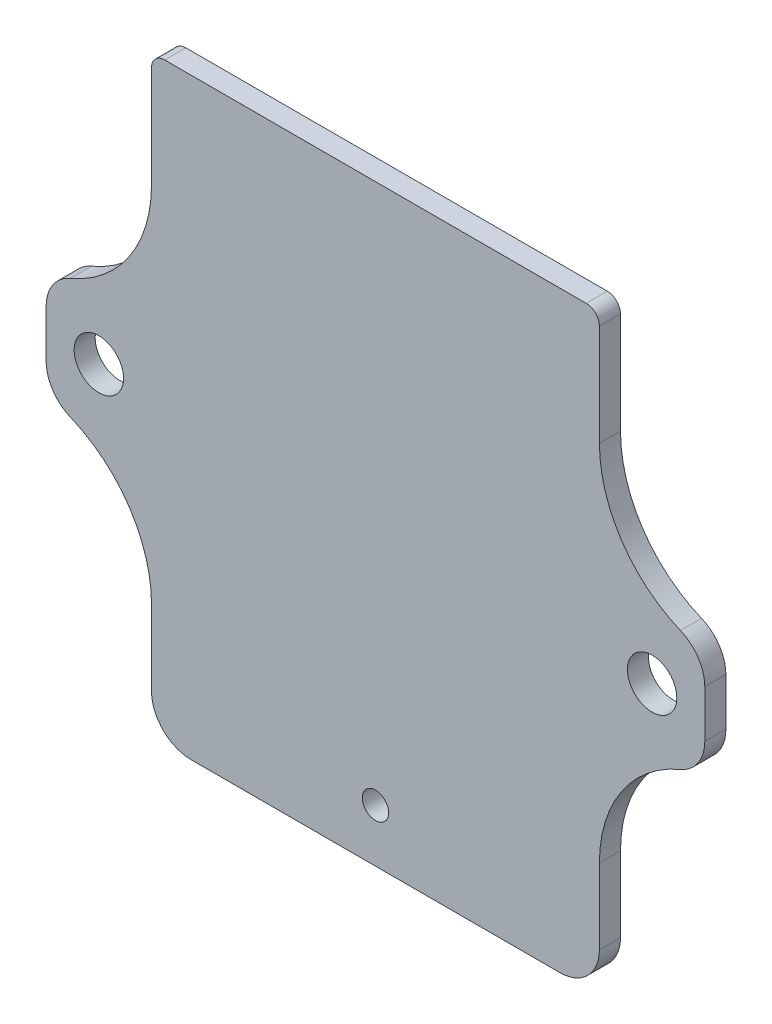
ISO-10303-21;
HEADER;
FILE_DESCRIPTION(('STEP AP214'),'2;1');
FILE_NAME('part.step','',(''),(''),'','','');
FILE_SCHEMA(('AUTOMOTIVE_DESIGN { 1 0 10303 214 1 1 1 1 }'));
ENDSEC;
DATA;
#1=APPLICATION_CONTEXT('core data for automotive mechanical design processes');
#2=APPLICATION_PROTOCOL_DEFINITION('international standard','automotive_design',2000,#1);
#3=PRODUCT_CONTEXT('',#1,'mechanical');
#4=PRODUCT('Part','Part','',(#3));
#5=PRODUCT_RELATED_PRODUCT_CATEGORY('part','',(#4));
#6=PRODUCT_DEFINITION_FORMATION('','',#4);
#7=PRODUCT_DEFINITION_CONTEXT('part definition',#1,'design');
#8=PRODUCT_DEFINITION('design','',#6,#7);
#9=PRODUCT_DEFINITION_SHAPE('','',#8);
#10=(LENGTH_UNIT() NAMED_UNIT(*) SI_UNIT(.MILLI.,.METRE.));
#11=(NAMED_UNIT(*) PLANE_ANGLE_UNIT() SI_UNIT($,.RADIAN.));
#12=(NAMED_UNIT(*) SI_UNIT($,.STERADIAN.) SOLID_ANGLE_UNIT());
#13=UNCERTAINTY_MEASURE_WITH_UNIT(LENGTH_MEASURE(1.E-05),#10,'distance_accuracy_value','');
#14=(GEOMETRIC_REPRESENTATION_CONTEXT(3) GLOBAL_UNCERTAINTY_ASSIGNED_CONTEXT((#13)) GLOBAL_UNIT_ASSIGNED_CONTEXT((#10,
#11,#12)) REPRESENTATION_CONTEXT('',''));
#15=CARTESIAN_POINT('',(0.,0.,0.));
#16=DIRECTION('',(0.,0.,1.));
#17=DIRECTION('',(1.,0.,0.));
#18=AXIS2_PLACEMENT_3D('',#15,#16,#17);
#19=CARTESIAN_POINT('',(40.8837568616855,108.1348825685,1.6));
#20=DIRECTION('',(0.,0.,1.));
#21=DIRECTION('',(1.,0.,0.));
#22=AXIS2_PLACEMENT_3D('',#19,#20,#21);
#23=PLANE('',#22);
#24=CARTESIAN_POINT('',(-7.1162431383145,94.3369235973671,1.6));
#25=DIRECTION('',(0.,0.,1.));
#26=DIRECTION('',(1.,0.,0.));
#27=AXIS2_PLACEMENT_3D('',#24,#25,#26);
#28=CIRCLE('',#27,1.875);
#29=CARTESIAN_POINT('',(-5.2412431383145,94.3369235973671,1.6));
#30=VERTEX_POINT('',#29);
#31=EDGE_CURVE('E391',#30,#30,#28,.T.);
#32=ORIENTED_EDGE('',*,*,#31,.F.);
#33=EDGE_LOOP('',(#32));
#34=FACE_BOUND('',#33,.T.);
#35=CARTESIAN_POINT('',(40.8837568616855,108.1348825685,1.6));
#36=DIRECTION('',(0.,0.,-1.));
#37=DIRECTION('',(1.,0.,0.));
#38=AXIS2_PLACEMENT_3D('',#35,#36,#37);
#39=CIRCLE('',#38,10.);
#40=CARTESIAN_POINT('',(37.0376030155317,98.9041133377306,1.6));
#41=VERTEX_POINT('',#40);
#42=CARTESIAN_POINT('',(30.8837568616855,108.1348825685,1.6));
#43=VERTEX_POINT('',#42);
#44=EDGE_CURVE('E241',#41,#43,#39,.T.);
#45=ORIENTED_EDGE('',*,*,#44,.T.);
#46=DIRECTION('',(0.,1.,0.));
#47=VECTOR('',#46,1.);
#48=CARTESIAN_POINT('',(30.8837568616855,108.1348825685,1.6));
#49=LINE('',#48,#47);
#50=CARTESIAN_POINT('',(30.8837568616855,115.836923597367,1.6));
#51=VERTEX_POINT('',#50);
#52=EDGE_CURVE('E129',#43,#51,#49,.T.);
#53=ORIENTED_EDGE('',*,*,#52,.T.);
#54=CARTESIAN_POINT('',(29.8837568616855,115.836923597367,1.6));
#55=DIRECTION('',(0.,0.,1.));
#56=DIRECTION('',(1.,0.,0.));
#57=AXIS2_PLACEMENT_3D('',#54,#55,#56);
#58=CIRCLE('',#57,1.);
#59=CARTESIAN_POINT('',(29.8837568616855,116.836923597367,1.6));
#60=VERTEX_POINT('',#59);
#61=EDGE_CURVE('E292',#51,#60,#58,.T.);
#62=ORIENTED_EDGE('',*,*,#61,.T.);
#63=DIRECTION('',(-1.,0.,0.));
#64=VECTOR('',#63,1.);
#65=CARTESIAN_POINT('',(29.8837568616855,116.836923597367,1.6));
#66=LINE('',#65,#64);
#67=CARTESIAN_POINT('',(-2.1162431383145,116.836923597367,1.6));
#68=VERTEX_POINT('',#67);
#69=EDGE_CURVE('E311',#60,#68,#66,.T.);
#70=ORIENTED_EDGE('',*,*,#69,.T.);
#71=CARTESIAN_POINT('',(-2.1162431383145,115.836923597367,1.6));
#72=DIRECTION('',(0.,0.,1.));
#73=DIRECTION('',(1.,0.,0.));
#74=AXIS2_PLACEMENT_3D('',#71,#72,#73);
#75=CIRCLE('',#74,1.);
#76=CARTESIAN_POINT('',(-3.1162431383145,115.836923597367,1.6));
#77=VERTEX_POINT('',#76);
#78=EDGE_CURVE('E308',#68,#77,#75,.T.);
#79=ORIENTED_EDGE('',*,*,#78,.T.);
#80=DIRECTION('',(0.,-1.,0.));
#81=VECTOR('',#80,1.);
#82=CARTESIAN_POINT('',(-3.1162431383145,115.836923597367,1.6));
#83=LINE('',#82,#81);
#84=CARTESIAN_POINT('',(-3.1162431383145,108.1348825685,1.6));
#85=VERTEX_POINT('',#84);
#86=EDGE_CURVE('E310',#77,#85,#83,.T.);
#87=ORIENTED_EDGE('',*,*,#86,.T.);
#88=CARTESIAN_POINT('',(-13.1162431383145,108.1348825685,1.6));
#89=DIRECTION('',(0.,0.,-1.));
#90=DIRECTION('',(1.,0.,0.));
#91=AXIS2_PLACEMENT_3D('',#88,#89,#90);
#92=CIRCLE('',#91,10.);
#93=CARTESIAN_POINT('',(-9.27008929216066,98.9041133377306,1.6));
#94=VERTEX_POINT('',#93);
#95=EDGE_CURVE('E313',#85,#94,#92,.T.);
#96=ORIENTED_EDGE('',*,*,#95,.T.);
#97=CARTESIAN_POINT('',(-8.11624313831451,96.1348825684998,1.6));
#98=DIRECTION('',(0.,0.,1.));
#99=DIRECTION('',(1.,0.,0.));
#100=AXIS2_PLACEMENT_3D('',#97,#98,#99);
#101=CIRCLE('',#100,3.);
#102=CARTESIAN_POINT('',(-11.1162431383145,96.1348825684998,1.6));
#103=VERTEX_POINT('',#102);
#104=EDGE_CURVE('E319',#94,#103,#101,.T.);
#105=ORIENTED_EDGE('',*,*,#104,.T.);
#106=DIRECTION('',(0.,-1.,0.));
#107=VECTOR('',#106,1.);
#108=CARTESIAN_POINT('',(-11.1162431383145,96.1348825684998,1.6));
#109=LINE('',#108,#107);
#110=CARTESIAN_POINT('',(-11.1162431383145,92.5389646262344,1.6));
#111=VERTEX_POINT('',#110);
#112=EDGE_CURVE('E321',#103,#111,#109,.T.);
#113=ORIENTED_EDGE('',*,*,#112,.T.);
#114=CARTESIAN_POINT('',(-8.11624313831451,92.5389646262344,1.6));
#115=DIRECTION('',(0.,0.,1.));
#116=DIRECTION('',(1.,0.,0.));
#117=AXIS2_PLACEMENT_3D('',#114,#115,#116);
#118=CIRCLE('',#117,3.);
#119=CARTESIAN_POINT('',(-9.27008929216066,89.7697338570036,1.6));
#120=VERTEX_POINT('',#119);
#121=EDGE_CURVE('E323',#111,#120,#118,.T.);
#122=ORIENTED_EDGE('',*,*,#121,.T.);
#123=CARTESIAN_POINT('',(-13.1162431383145,80.5389646262344,1.6));
#124=DIRECTION('',(0.,0.,-1.));
#125=DIRECTION('',(1.,0.,0.));
#126=AXIS2_PLACEMENT_3D('',#123,#124,#125);
#127=CIRCLE('',#126,10.);
#128=CARTESIAN_POINT('',(-3.11624313831451,80.5389646262344,1.6));
#129=VERTEX_POINT('',#128);
#130=EDGE_CURVE('E325',#120,#129,#127,.T.);
#131=ORIENTED_EDGE('',*,*,#130,.T.);
#132=DIRECTION('',(0.,-1.,0.));
#133=VECTOR('',#132,1.);
#134=CARTESIAN_POINT('',(-3.1162431383145,80.5389646262344,1.6));
#135=LINE('',#134,#133);
#136=CARTESIAN_POINT('',(-3.1162431383145,74.8369235973671,1.6));
#137=VERTEX_POINT('',#136);
#138=EDGE_CURVE('E327',#129,#137,#135,.T.);
#139=ORIENTED_EDGE('',*,*,#138,.T.);
#140=CARTESIAN_POINT('',(-0.116243138314503,74.8369235973671,1.6));
#141=DIRECTION('',(0.,0.,1.));
#142=DIRECTION('',(1.,0.,0.));
#143=AXIS2_PLACEMENT_3D('',#140,#141,#142);
#144=CIRCLE('',#143,3.);
#145=CARTESIAN_POINT('',(-0.116243138314504,71.8369235973671,1.6));
#146=VERTEX_POINT('',#145);
#147=EDGE_CURVE('E329',#137,#146,#144,.T.);
#148=ORIENTED_EDGE('',*,*,#147,.T.);
#149=DIRECTION('',(1.,0.,0.));
#150=VECTOR('',#149,1.);
#151=CARTESIAN_POINT('',(-0.116243138314504,71.8369235973671,1.6));
#152=LINE('',#151,#150);
#153=CARTESIAN_POINT('',(27.8837568616855,71.8369235973671,1.6));
#154=VERTEX_POINT('',#153);
#155=EDGE_CURVE('E331',#146,#154,#152,.T.);
#156=ORIENTED_EDGE('',*,*,#155,.T.);
#157=CARTESIAN_POINT('',(27.8837568616855,74.8369235973671,1.6));
#158=DIRECTION('',(0.,0.,1.));
#159=DIRECTION('',(1.,0.,0.));
#160=AXIS2_PLACEMENT_3D('',#157,#158,#159);
#161=CIRCLE('',#160,3.);
#162=CARTESIAN_POINT('',(30.8837568616855,74.8369235973671,1.6));
#163=VERTEX_POINT('',#162);
#164=EDGE_CURVE('E333',#154,#163,#161,.T.);
#165=ORIENTED_EDGE('',*,*,#164,.T.);
#166=DIRECTION('',(0.,1.,0.));
#167=VECTOR('',#166,1.);
#168=CARTESIAN_POINT('',(30.8837568616855,74.8369235973671,1.6));
#169=LINE('',#168,#167);
#170=CARTESIAN_POINT('',(30.8837568616855,80.5389646262344,1.6));
#171=VERTEX_POINT('',#170);
#172=EDGE_CURVE('E335',#163,#171,#169,.T.);
#173=ORIENTED_EDGE('',*,*,#172,.T.);
#174=CARTESIAN_POINT('',(40.8837568616855,80.5389646262344,1.6));
#175=DIRECTION('',(0.,0.,-1.));
#176=DIRECTION('',(1.,0.,0.));
#177=AXIS2_PLACEMENT_3D('',#174,#175,#176);
#178=CIRCLE('',#177,10.);
#179=CARTESIAN_POINT('',(37.0376030155317,89.7697338570037,1.6));
#180=VERTEX_POINT('',#179);
#181=EDGE_CURVE('E184',#171,#180,#178,.T.);
#182=ORIENTED_EDGE('',*,*,#181,.T.);
#183=CARTESIAN_POINT('',(35.8837568616855,92.5389646262344,1.6));
#184=DIRECTION('',(0.,0.,1.));
#185=DIRECTION('',(1.,0.,0.));
#186=AXIS2_PLACEMENT_3D('',#183,#184,#185);
#187=CIRCLE('',#186,3.);
#188=CARTESIAN_POINT('',(38.8837568616855,92.5389646262344,1.6));
#189=VERTEX_POINT('',#188);
#190=EDGE_CURVE('E178',#180,#189,#187,.T.);
#191=ORIENTED_EDGE('',*,*,#190,.T.);
#192=DIRECTION('',(0.,1.,0.));
#193=VECTOR('',#192,1.);
#194=CARTESIAN_POINT('',(38.8837568616855,92.5389646262344,1.6));
#195=LINE('',#194,#193);
#196=CARTESIAN_POINT('',(38.8837568616855,96.1348825684998,1.6));
#197=VERTEX_POINT('',#196);
#198=EDGE_CURVE('E182',#189,#197,#195,.T.);
#199=ORIENTED_EDGE('',*,*,#198,.T.);
#200=CARTESIAN_POINT('',(35.8837568616855,96.1348825684998,1.6));
#201=DIRECTION('',(0.,0.,1.));
#202=DIRECTION('',(1.,0.,0.));
#203=AXIS2_PLACEMENT_3D('',#200,#201,#202);
#204=CIRCLE('',#203,3.);
#205=EDGE_CURVE('E50',#197,#41,#204,.T.);
#206=ORIENTED_EDGE('',*,*,#205,.T.);
#207=EDGE_LOOP('',(#45,#53,#62,#70,#79,#87,#96,#105,#113,#122,#131,#139,#148,#156,#165,#173,
#182,#191,#199,#206));
#208=FACE_BOUND('',#207,.T.);
#209=CARTESIAN_POINT('',(13.8837568616855,75.8369235973671,1.6));
#210=DIRECTION('',(0.,0.,1.));
#211=DIRECTION('',(1.,0.,0.));
#212=AXIS2_PLACEMENT_3D('',#209,#210,#211);
#213=CIRCLE('',#212,1.00000000000001);
#214=CARTESIAN_POINT('',(14.8837568616855,75.8369235973671,1.6));
#215=VERTEX_POINT('',#214);
#216=EDGE_CURVE('E206',#215,#215,#213,.T.);
#217=ORIENTED_EDGE('',*,*,#216,.F.);
#218=EDGE_LOOP('',(#217));
#219=FACE_BOUND('',#218,.T.);
#220=CARTESIAN_POINT('',(34.8837568616855,94.3369235973671,1.6));
#221=DIRECTION('',(0.,0.,1.));
#222=DIRECTION('',(1.,0.,0.));
#223=AXIS2_PLACEMENT_3D('',#220,#221,#222);
#224=CIRCLE('',#223,1.875);
#225=CARTESIAN_POINT('',(36.7587568616855,94.3369235973671,1.6));
#226=VERTEX_POINT('',#225);
#227=EDGE_CURVE('E382',#226,#226,#224,.T.);
#228=ORIENTED_EDGE('',*,*,#227,.F.);
#229=EDGE_LOOP('',(#228));
#230=FACE_BOUND('',#229,.T.);
#231=ADVANCED_FACE('F33',(#34,#208,#219,#230),#23,.T.);
#232=CARTESIAN_POINT('',(40.8837568616855,108.1348825685,0.));
#233=DIRECTION('',(0.,0.,1.));
#234=DIRECTION('',(1.,0.,0.));
#235=AXIS2_PLACEMENT_3D('',#232,#233,#234);
#236=PLANE('',#235);
#237=CARTESIAN_POINT('',(-7.1162431383145,94.3369235973671,0.));
#238=DIRECTION('',(0.,0.,1.));
#239=DIRECTION('',(1.,0.,0.));
#240=AXIS2_PLACEMENT_3D('',#237,#238,#239);
#241=CIRCLE('',#240,1.875);
#242=CARTESIAN_POINT('',(-5.2412431383145,94.3369235973671,0.));
#243=VERTEX_POINT('',#242);
#244=EDGE_CURVE('E388',#243,#243,#241,.T.);
#245=ORIENTED_EDGE('',*,*,#244,.T.);
#246=EDGE_LOOP('',(#245));
#247=FACE_BOUND('',#246,.T.);
#248=CARTESIAN_POINT('',(40.8837568616855,108.1348825685,0.));
#249=DIRECTION('',(0.,0.,-1.));
#250=DIRECTION('',(1.,0.,0.));
#251=AXIS2_PLACEMENT_3D('',#248,#249,#250);
#252=CIRCLE('',#251,10.);
#253=CARTESIAN_POINT('',(37.0376030155317,98.9041133377306,0.));
#254=VERTEX_POINT('',#253);
#255=CARTESIAN_POINT('',(30.8837568616855,108.1348825685,0.));
#256=VERTEX_POINT('',#255);
#257=EDGE_CURVE('E202',#254,#256,#252,.T.);
#258=ORIENTED_EDGE('',*,*,#257,.F.);
#259=CARTESIAN_POINT('',(35.8837568616855,96.1348825684998,0.));
#260=DIRECTION('',(0.,0.,1.));
#261=DIRECTION('',(1.,0.,0.));
#262=AXIS2_PLACEMENT_3D('',#259,#260,#261);
#263=CIRCLE('',#262,3.);
#264=CARTESIAN_POINT('',(38.8837568616855,96.1348825684998,0.));
#265=VERTEX_POINT('',#264);
#266=EDGE_CURVE('E121',#265,#254,#263,.T.);
#267=ORIENTED_EDGE('',*,*,#266,.F.);
#268=DIRECTION('',(0.,1.,0.));
#269=VECTOR('',#268,1.);
#270=CARTESIAN_POINT('',(38.8837568616855,92.5389646262344,0.));
#271=LINE('',#270,#269);
#272=CARTESIAN_POINT('',(38.8837568616855,92.5389646262344,0.));
#273=VERTEX_POINT('',#272);
#274=EDGE_CURVE('E115',#273,#265,#271,.T.);
#275=ORIENTED_EDGE('',*,*,#274,.F.);
#276=CARTESIAN_POINT('',(35.8837568616855,92.5389646262344,0.));
#277=DIRECTION('',(0.,0.,1.));
#278=DIRECTION('',(1.,0.,0.));
#279=AXIS2_PLACEMENT_3D('',#276,#277,#278);
#280=CIRCLE('',#279,3.);
#281=CARTESIAN_POINT('',(37.0376030155317,89.7697338570037,0.));
#282=VERTEX_POINT('',#281);
#283=EDGE_CURVE('E192',#282,#273,#280,.T.);
#284=ORIENTED_EDGE('',*,*,#283,.F.);
#285=CARTESIAN_POINT('',(40.8837568616855,80.5389646262344,0.));
#286=DIRECTION('',(0.,0.,-1.));
#287=DIRECTION('',(1.,0.,0.));
#288=AXIS2_PLACEMENT_3D('',#285,#286,#287);
#289=CIRCLE('',#288,10.);
#290=CARTESIAN_POINT('',(30.8837568616855,80.5389646262344,0.));
#291=VERTEX_POINT('',#290);
#292=EDGE_CURVE('E236',#291,#282,#289,.T.);
#293=ORIENTED_EDGE('',*,*,#292,.F.);
#294=DIRECTION('',(0.,1.,0.));
#295=VECTOR('',#294,1.);
#296=CARTESIAN_POINT('',(30.8837568616855,74.8369235973671,0.));
#297=LINE('',#296,#295);
#298=CARTESIAN_POINT('',(30.8837568616855,74.8369235973671,0.));
#299=VERTEX_POINT('',#298);
#300=EDGE_CURVE('E234',#299,#291,#297,.T.);
#301=ORIENTED_EDGE('',*,*,#300,.F.);
#302=CARTESIAN_POINT('',(27.8837568616855,74.8369235973671,0.));
#303=DIRECTION('',(0.,0.,1.));
#304=DIRECTION('',(1.,0.,0.));
#305=AXIS2_PLACEMENT_3D('',#302,#303,#304);
#306=CIRCLE('',#305,3.);
#307=CARTESIAN_POINT('',(27.8837568616855,71.8369235973671,0.));
#308=VERTEX_POINT('',#307);
#309=EDGE_CURVE('E232',#308,#299,#306,.T.);
#310=ORIENTED_EDGE('',*,*,#309,.F.);
#311=DIRECTION('',(1.,0.,0.));
#312=VECTOR('',#311,1.);
#313=CARTESIAN_POINT('',(-0.116243138314504,71.8369235973671,0.));
#314=LINE('',#313,#312);
#315=CARTESIAN_POINT('',(-0.116243138314504,71.8369235973671,0.));
#316=VERTEX_POINT('',#315);
#317=EDGE_CURVE('E230',#316,#308,#314,.T.);
#318=ORIENTED_EDGE('',*,*,#317,.F.);
#319=CARTESIAN_POINT('',(-0.116243138314503,74.8369235973671,0.));
#320=DIRECTION('',(0.,0.,1.));
#321=DIRECTION('',(1.,0.,0.));
#322=AXIS2_PLACEMENT_3D('',#319,#320,#321);
#323=CIRCLE('',#322,3.);
#324=CARTESIAN_POINT('',(-3.1162431383145,74.8369235973671,0.));
#325=VERTEX_POINT('',#324);
#326=EDGE_CURVE('E228',#325,#316,#323,.T.);
#327=ORIENTED_EDGE('',*,*,#326,.F.);
#328=DIRECTION('',(0.,-1.,0.));
#329=VECTOR('',#328,1.);
#330=CARTESIAN_POINT('',(-3.1162431383145,80.5389646262344,0.));
#331=LINE('',#330,#329);
#332=CARTESIAN_POINT('',(-3.11624313831451,80.5389646262344,0.));
#333=VERTEX_POINT('',#332);
#334=EDGE_CURVE('E226',#333,#325,#331,.T.);
#335=ORIENTED_EDGE('',*,*,#334,.F.);
#336=CARTESIAN_POINT('',(-13.1162431383145,80.5389646262344,0.));
#337=DIRECTION('',(0.,0.,-1.));
#338=DIRECTION('',(1.,0.,0.));
#339=AXIS2_PLACEMENT_3D('',#336,#337,#338);
#340=CIRCLE('',#339,10.);
#341=CARTESIAN_POINT('',(-9.27008929216066,89.7697338570036,0.));
#342=VERTEX_POINT('',#341);
#343=EDGE_CURVE('E224',#342,#333,#340,.T.);
#344=ORIENTED_EDGE('',*,*,#343,.F.);
#345=CARTESIAN_POINT('',(-8.11624313831451,92.5389646262344,0.));
#346=DIRECTION('',(0.,0.,1.));
#347=DIRECTION('',(1.,0.,0.));
#348=AXIS2_PLACEMENT_3D('',#345,#346,#347);
#349=CIRCLE('',#348,3.);
#350=CARTESIAN_POINT('',(-11.1162431383145,92.5389646262344,0.));
#351=VERTEX_POINT('',#350);
#352=EDGE_CURVE('E222',#351,#342,#349,.T.);
#353=ORIENTED_EDGE('',*,*,#352,.F.);
#354=DIRECTION('',(0.,-1.,0.));
#355=VECTOR('',#354,1.);
#356=CARTESIAN_POINT('',(-11.1162431383145,96.1348825684998,0.));
#357=LINE('',#356,#355);
#358=CARTESIAN_POINT('',(-11.1162431383145,96.1348825684998,0.));
#359=VERTEX_POINT('',#358);
#360=EDGE_CURVE('E220',#359,#351,#357,.T.);
#361=ORIENTED_EDGE('',*,*,#360,.F.);
#362=CARTESIAN_POINT('',(-8.11624313831451,96.1348825684998,0.));
#363=DIRECTION('',(0.,0.,1.));
#364=DIRECTION('',(1.,0.,0.));
#365=AXIS2_PLACEMENT_3D('',#362,#363,#364);
#366=CIRCLE('',#365,3.);
#367=CARTESIAN_POINT('',(-9.27008929216066,98.9041133377306,0.));
#368=VERTEX_POINT('',#367);
#369=EDGE_CURVE('E218',#368,#359,#366,.T.);
#370=ORIENTED_EDGE('',*,*,#369,.F.);
#371=CARTESIAN_POINT('',(-13.1162431383145,108.1348825685,0.));
#372=DIRECTION('',(0.,0.,-1.));
#373=DIRECTION('',(1.,0.,0.));
#374=AXIS2_PLACEMENT_3D('',#371,#372,#373);
#375=CIRCLE('',#374,10.);
#376=CARTESIAN_POINT('',(-3.1162431383145,108.1348825685,0.));
#377=VERTEX_POINT('',#376);
#378=EDGE_CURVE('E216',#377,#368,#375,.T.);
#379=ORIENTED_EDGE('',*,*,#378,.F.);
#380=DIRECTION('',(0.,-1.,0.));
#381=VECTOR('',#380,1.);
#382=CARTESIAN_POINT('',(-3.1162431383145,115.836923597367,0.));
#383=LINE('',#382,#381);
#384=CARTESIAN_POINT('',(-3.1162431383145,115.836923597367,0.));
#385=VERTEX_POINT('',#384);
#386=EDGE_CURVE('E214',#385,#377,#383,.T.);
#387=ORIENTED_EDGE('',*,*,#386,.F.);
#388=CARTESIAN_POINT('',(-2.1162431383145,115.836923597367,0.));
#389=DIRECTION('',(0.,0.,1.));
#390=DIRECTION('',(1.,0.,0.));
#391=AXIS2_PLACEMENT_3D('',#388,#389,#390);
#392=CIRCLE('',#391,1.);
#393=CARTESIAN_POINT('',(-2.1162431383145,116.836923597367,0.));
#394=VERTEX_POINT('',#393);
#395=EDGE_CURVE('E212',#394,#385,#392,.T.);
#396=ORIENTED_EDGE('',*,*,#395,.F.);
#397=DIRECTION('',(-1.,0.,0.));
#398=VECTOR('',#397,1.);
#399=CARTESIAN_POINT('',(29.8837568616855,116.836923597367,0.));
#400=LINE('',#399,#398);
#401=CARTESIAN_POINT('',(29.8837568616855,116.836923597367,0.));
#402=VERTEX_POINT('',#401);
#403=EDGE_CURVE('E210',#402,#394,#400,.T.);
#404=ORIENTED_EDGE('',*,*,#403,.F.);
#405=CARTESIAN_POINT('',(29.8837568616855,115.836923597367,0.));
#406=DIRECTION('',(0.,0.,1.));
#407=DIRECTION('',(1.,0.,0.));
#408=AXIS2_PLACEMENT_3D('',#405,#406,#407);
#409=CIRCLE('',#408,1.);
#410=CARTESIAN_POINT('',(30.8837568616855,115.836923597367,0.));
#411=VERTEX_POINT('',#410);
#412=EDGE_CURVE('E208',#411,#402,#409,.T.);
#413=ORIENTED_EDGE('',*,*,#412,.F.);
#414=DIRECTION('',(0.,1.,0.));
#415=VECTOR('',#414,1.);
#416=CARTESIAN_POINT('',(30.8837568616855,108.1348825685,0.));
#417=LINE('',#416,#415);
#418=EDGE_CURVE('E205',#256,#411,#417,.T.);
#419=ORIENTED_EDGE('',*,*,#418,.F.);
#420=EDGE_LOOP('',(#258,#267,#275,#284,#293,#301,#310,#318,#327,#335,#344,#353,#361,#370,#379,
#387,#396,#404,#413,#419));
#421=FACE_BOUND('',#420,.T.);
#422=CARTESIAN_POINT('',(13.8837568616855,75.8369235973671,0.));
#423=DIRECTION('',(0.,0.,1.));
#424=DIRECTION('',(1.,0.,0.));
#425=AXIS2_PLACEMENT_3D('',#422,#423,#424);
#426=CIRCLE('',#425,1.00000000000001);
#427=CARTESIAN_POINT('',(14.8837568616855,75.8369235973671,0.));
#428=VERTEX_POINT('',#427);
#429=EDGE_CURVE('E394',#428,#428,#426,.T.);
#430=ORIENTED_EDGE('',*,*,#429,.T.);
#431=EDGE_LOOP('',(#430));
#432=FACE_BOUND('',#431,.T.);
#433=CARTESIAN_POINT('',(34.8837568616855,94.3369235973671,0.));
#434=DIRECTION('',(0.,0.,1.));
#435=DIRECTION('',(1.,0.,0.));
#436=AXIS2_PLACEMENT_3D('',#433,#434,#435);
#437=CIRCLE('',#436,1.875);
#438=CARTESIAN_POINT('',(36.7587568616855,94.3369235973671,0.));
#439=VERTEX_POINT('',#438);
#440=EDGE_CURVE('E385',#439,#439,#437,.T.);
#441=ORIENTED_EDGE('',*,*,#440,.T.);
#442=EDGE_LOOP('',(#441));
#443=FACE_BOUND('',#442,.T.);
#444=ADVANCED_FACE('F296',(#247,#421,#432,#443),#236,.F.);
#445=CARTESIAN_POINT('',(40.8837568616855,108.1348825685,1.6));
#446=DIRECTION('',(0.,0.,-1.));
#447=DIRECTION('',(-1.,0.,0.));
#448=AXIS2_PLACEMENT_3D('',#445,#446,#447);
#449=CYLINDRICAL_SURFACE('',#448,10.);
#450=ORIENTED_EDGE('',*,*,#257,.T.);
#451=DIRECTION('',(0.,0.,-1.));
#452=VECTOR('',#451,1.);
#453=CARTESIAN_POINT('',(30.8837568616855,108.1348825685,1.6));
#454=LINE('',#453,#452);
#455=EDGE_CURVE('E11',#43,#256,#454,.T.);
#456=ORIENTED_EDGE('',*,*,#455,.F.);
#457=ORIENTED_EDGE('',*,*,#44,.F.);
#458=DIRECTION('',(0.,0.,-1.));
#459=VECTOR('',#458,1.);
#460=CARTESIAN_POINT('',(37.0376030155317,98.9041133377306,1.6));
#461=LINE('',#460,#459);
#462=EDGE_CURVE('E198',#41,#254,#461,.T.);
#463=ORIENTED_EDGE('',*,*,#462,.T.);
#464=EDGE_LOOP('',(#450,#456,#457,#463));
#465=FACE_BOUND('',#464,.T.);
#466=ADVANCED_FACE('F35',(#465),#449,.F.);
#467=CARTESIAN_POINT('',(30.8837568616855,108.1348825685,1.6));
#468=DIRECTION('',(-1.,0.,0.));
#469=DIRECTION('',(0.,0.,1.));
#470=AXIS2_PLACEMENT_3D('',#467,#468,#469);
#471=PLANE('',#470);
#472=ORIENTED_EDGE('',*,*,#418,.T.);
#473=DIRECTION('',(0.,0.,-1.));
#474=VECTOR('',#473,1.);
#475=CARTESIAN_POINT('',(30.8837568616855,115.836923597367,1.6));
#476=LINE('',#475,#474);
#477=EDGE_CURVE('E42',#51,#411,#476,.T.);
#478=ORIENTED_EDGE('',*,*,#477,.F.);
#479=ORIENTED_EDGE('',*,*,#52,.F.);
#480=ORIENTED_EDGE('',*,*,#455,.T.);
#481=EDGE_LOOP('',(#472,#478,#479,#480));
#482=FACE_BOUND('',#481,.T.);
#483=ADVANCED_FACE('F575',(#482),#471,.F.);
#484=CARTESIAN_POINT('',(29.8837568616855,115.836923597367,1.6));
#485=DIRECTION('',(0.,0.,-1.));
#486=DIRECTION('',(-1.,0.,0.));
#487=AXIS2_PLACEMENT_3D('',#484,#485,#486);
#488=CYLINDRICAL_SURFACE('',#487,1.);
#489=ORIENTED_EDGE('',*,*,#412,.T.);
#490=DIRECTION('',(0.,0.,-1.));
#491=VECTOR('',#490,1.);
#492=CARTESIAN_POINT('',(29.8837568616855,116.836923597367,1.6));
#493=LINE('',#492,#491);
#494=EDGE_CURVE('E284',#60,#402,#493,.T.);
#495=ORIENTED_EDGE('',*,*,#494,.F.);
#496=ORIENTED_EDGE('',*,*,#61,.F.);
#497=ORIENTED_EDGE('',*,*,#477,.T.);
#498=EDGE_LOOP('',(#489,#495,#496,#497));
#499=FACE_BOUND('',#498,.T.);
#500=ADVANCED_FACE('F290',(#499),#488,.T.);
#501=CARTESIAN_POINT('',(29.8837568616855,116.836923597367,1.6));
#502=DIRECTION('',(0.,-1.,0.));
#503=DIRECTION('',(0.,0.,-1.));
#504=AXIS2_PLACEMENT_3D('',#501,#502,#503);
#505=PLANE('',#504);
#506=ORIENTED_EDGE('',*,*,#403,.T.);
#507=DIRECTION('',(0.,0.,-1.));
#508=VECTOR('',#507,1.);
#509=CARTESIAN_POINT('',(-2.1162431383145,116.836923597367,1.6));
#510=LINE('',#509,#508);
#511=EDGE_CURVE('E281',#68,#394,#510,.T.);
#512=ORIENTED_EDGE('',*,*,#511,.F.);
#513=ORIENTED_EDGE('',*,*,#69,.F.);
#514=ORIENTED_EDGE('',*,*,#494,.T.);
#515=EDGE_LOOP('',(#506,#512,#513,#514));
#516=FACE_BOUND('',#515,.T.);
#517=ADVANCED_FACE('F302',(#516),#505,.F.);
#518=CARTESIAN_POINT('',(-2.1162431383145,115.836923597367,1.6));
#519=DIRECTION('',(0.,0.,-1.));
#520=DIRECTION('',(-1.,0.,0.));
#521=AXIS2_PLACEMENT_3D('',#518,#519,#520);
#522=CYLINDRICAL_SURFACE('',#521,1.);
#523=ORIENTED_EDGE('',*,*,#395,.T.);
#524=DIRECTION('',(0.,0.,-1.));
#525=VECTOR('',#524,1.);
#526=CARTESIAN_POINT('',(-3.1162431383145,115.836923597367,1.6));
#527=LINE('',#526,#525);
#528=EDGE_CURVE('E278',#77,#385,#527,.T.);
#529=ORIENTED_EDGE('',*,*,#528,.F.);
#530=ORIENTED_EDGE('',*,*,#78,.F.);
#531=ORIENTED_EDGE('',*,*,#511,.T.);
#532=EDGE_LOOP('',(#523,#529,#530,#531));
#533=FACE_BOUND('',#532,.T.);
#534=ADVANCED_FACE('F306',(#533),#522,.T.);
#535=CARTESIAN_POINT('',(-3.1162431383145,115.836923597367,1.6));
#536=DIRECTION('',(1.,0.,0.));
#537=DIRECTION('',(0.,1.,0.));
#538=AXIS2_PLACEMENT_3D('',#535,#536,#537);
#539=PLANE('',#538);
#540=ORIENTED_EDGE('',*,*,#386,.T.);
#541=DIRECTION('',(0.,0.,-1.));
#542=VECTOR('',#541,1.);
#543=CARTESIAN_POINT('',(-3.1162431383145,108.1348825685,1.6));
#544=LINE('',#543,#542);
#545=EDGE_CURVE('E275',#85,#377,#544,.T.);
#546=ORIENTED_EDGE('',*,*,#545,.F.);
#547=ORIENTED_EDGE('',*,*,#86,.F.);
#548=ORIENTED_EDGE('',*,*,#528,.T.);
#549=EDGE_LOOP('',(#540,#546,#547,#548));
#550=FACE_BOUND('',#549,.T.);
#551=ADVANCED_FACE('F540',(#550),#539,.F.);
#552=CARTESIAN_POINT('',(-13.1162431383145,108.1348825685,1.6));
#553=DIRECTION('',(0.,0.,-1.));
#554=DIRECTION('',(-1.,0.,0.));
#555=AXIS2_PLACEMENT_3D('',#552,#553,#554);
#556=CYLINDRICAL_SURFACE('',#555,10.);
#557=ORIENTED_EDGE('',*,*,#378,.T.);
#558=DIRECTION('',(0.,0.,-1.));
#559=VECTOR('',#558,1.);
#560=CARTESIAN_POINT('',(-9.27008929216066,98.9041133377306,1.6));
#561=LINE('',#560,#559);
#562=EDGE_CURVE('E272',#94,#368,#561,.T.);
#563=ORIENTED_EDGE('',*,*,#562,.F.);
#564=ORIENTED_EDGE('',*,*,#95,.F.);
#565=ORIENTED_EDGE('',*,*,#545,.T.);
#566=EDGE_LOOP('',(#557,#563,#564,#565));
#567=FACE_BOUND('',#566,.T.);
#568=ADVANCED_FACE('F530',(#567),#556,.F.);
#569=CARTESIAN_POINT('',(-8.11624313831451,96.1348825684998,1.6));
#570=DIRECTION('',(0.,0.,-1.));
#571=DIRECTION('',(-1.,0.,0.));
#572=AXIS2_PLACEMENT_3D('',#569,#570,#571);
#573=CYLINDRICAL_SURFACE('',#572,3.);
#574=ORIENTED_EDGE('',*,*,#369,.T.);
#575=DIRECTION('',(0.,0.,-1.));
#576=VECTOR('',#575,1.);
#577=CARTESIAN_POINT('',(-11.1162431383145,96.1348825684998,1.6));
#578=LINE('',#577,#576);
#579=EDGE_CURVE('E269',#103,#359,#578,.T.);
#580=ORIENTED_EDGE('',*,*,#579,.F.);
#581=ORIENTED_EDGE('',*,*,#104,.F.);
#582=ORIENTED_EDGE('',*,*,#562,.T.);
#583=EDGE_LOOP('',(#574,#580,#581,#582));
#584=FACE_BOUND('',#583,.T.);
#585=ADVANCED_FACE('F520',(#584),#573,.T.);
#586=CARTESIAN_POINT('',(-11.1162431383145,96.1348825684998,1.6));
#587=DIRECTION('',(1.,0.,0.));
#588=DIRECTION('',(0.,0.,-1.));
#589=AXIS2_PLACEMENT_3D('',#586,#587,#588);
#590=PLANE('',#589);
#591=ORIENTED_EDGE('',*,*,#360,.T.);
#592=DIRECTION('',(0.,0.,-1.));
#593=VECTOR('',#592,1.);
#594=CARTESIAN_POINT('',(-11.1162431383145,92.5389646262344,1.6));
#595=LINE('',#594,#593);
#596=EDGE_CURVE('E266',#111,#351,#595,.T.);
#597=ORIENTED_EDGE('',*,*,#596,.F.);
#598=ORIENTED_EDGE('',*,*,#112,.F.);
#599=ORIENTED_EDGE('',*,*,#579,.T.);
#600=EDGE_LOOP('',(#591,#597,#598,#599));
#601=FACE_BOUND('',#600,.T.);
#602=ADVANCED_FACE('F510',(#601),#590,.F.);
#603=CARTESIAN_POINT('',(-8.11624313831451,92.5389646262344,1.6));
#604=DIRECTION('',(0.,0.,-1.));
#605=DIRECTION('',(-1.,0.,0.));
#606=AXIS2_PLACEMENT_3D('',#603,#604,#605);
#607=CYLINDRICAL_SURFACE('',#606,3.);
#608=ORIENTED_EDGE('',*,*,#352,.T.);
#609=DIRECTION('',(0.,0.,-1.));
#610=VECTOR('',#609,1.);
#611=CARTESIAN_POINT('',(-9.27008929216066,89.7697338570036,1.6));
#612=LINE('',#611,#610);
#613=EDGE_CURVE('E263',#120,#342,#612,.T.);
#614=ORIENTED_EDGE('',*,*,#613,.F.);
#615=ORIENTED_EDGE('',*,*,#121,.F.);
#616=ORIENTED_EDGE('',*,*,#596,.T.);
#617=EDGE_LOOP('',(#608,#614,#615,#616));
#618=FACE_BOUND('',#617,.T.);
#619=ADVANCED_FACE('F500',(#618),#607,.T.);
#620=CARTESIAN_POINT('',(-13.1162431383145,80.5389646262344,1.6));
#621=DIRECTION('',(0.,0.,-1.));
#622=DIRECTION('',(-1.,0.,0.));
#623=AXIS2_PLACEMENT_3D('',#620,#621,#622);
#624=CYLINDRICAL_SURFACE('',#623,10.);
#625=ORIENTED_EDGE('',*,*,#343,.T.);
#626=DIRECTION('',(0.,0.,-1.));
#627=VECTOR('',#626,1.);
#628=CARTESIAN_POINT('',(-3.11624313831451,80.5389646262344,1.6));
#629=LINE('',#628,#627);
#630=EDGE_CURVE('E260',#129,#333,#629,.T.);
#631=ORIENTED_EDGE('',*,*,#630,.F.);
#632=ORIENTED_EDGE('',*,*,#130,.F.);
#633=ORIENTED_EDGE('',*,*,#613,.T.);
#634=EDGE_LOOP('',(#625,#631,#632,#633));
#635=FACE_BOUND('',#634,.T.);
#636=ADVANCED_FACE('F490',(#635),#624,.F.);
#637=CARTESIAN_POINT('',(-3.1162431383145,80.5389646262344,1.6));
#638=DIRECTION('',(1.,0.,0.));
#639=DIRECTION('',(0.,0.,-1.));
#640=AXIS2_PLACEMENT_3D('',#637,#638,#639);
#641=PLANE('',#640);
#642=ORIENTED_EDGE('',*,*,#334,.T.);
#643=DIRECTION('',(0.,0.,-1.));
#644=VECTOR('',#643,1.);
#645=CARTESIAN_POINT('',(-3.1162431383145,74.8369235973671,1.6));
#646=LINE('',#645,#644);
#647=EDGE_CURVE('E257',#137,#325,#646,.T.);
#648=ORIENTED_EDGE('',*,*,#647,.F.);
#649=ORIENTED_EDGE('',*,*,#138,.F.);
#650=ORIENTED_EDGE('',*,*,#630,.T.);
#651=EDGE_LOOP('',(#642,#648,#649,#650));
#652=FACE_BOUND('',#651,.T.);
#653=ADVANCED_FACE('F480',(#652),#641,.F.);
#654=CARTESIAN_POINT('',(-0.116243138314503,74.8369235973671,1.6));
#655=DIRECTION('',(0.,0.,-1.));
#656=DIRECTION('',(-1.,0.,0.));
#657=AXIS2_PLACEMENT_3D('',#654,#655,#656);
#658=CYLINDRICAL_SURFACE('',#657,3.);
#659=ORIENTED_EDGE('',*,*,#326,.T.);
#660=DIRECTION('',(0.,0.,-1.));
#661=VECTOR('',#660,1.);
#662=CARTESIAN_POINT('',(-0.116243138314504,71.8369235973671,1.6));
#663=LINE('',#662,#661);
#664=EDGE_CURVE('E254',#146,#316,#663,.T.);
#665=ORIENTED_EDGE('',*,*,#664,.F.);
#666=ORIENTED_EDGE('',*,*,#147,.F.);
#667=ORIENTED_EDGE('',*,*,#647,.T.);
#668=EDGE_LOOP('',(#659,#665,#666,#667));
#669=FACE_BOUND('',#668,.T.);
#670=ADVANCED_FACE('F470',(#669),#658,.T.);
#671=CARTESIAN_POINT('',(-0.116243138314504,71.8369235973671,1.6));
#672=DIRECTION('',(0.,1.,0.));
#673=DIRECTION('',(0.,0.,1.));
#674=AXIS2_PLACEMENT_3D('',#671,#672,#673);
#675=PLANE('',#674);
#676=ORIENTED_EDGE('',*,*,#317,.T.);
#677=DIRECTION('',(0.,0.,-1.));
#678=VECTOR('',#677,1.);
#679=CARTESIAN_POINT('',(27.8837568616855,71.8369235973671,1.6));
#680=LINE('',#679,#678);
#681=EDGE_CURVE('E251',#154,#308,#680,.T.);
#682=ORIENTED_EDGE('',*,*,#681,.F.);
#683=ORIENTED_EDGE('',*,*,#155,.F.);
#684=ORIENTED_EDGE('',*,*,#664,.T.);
#685=EDGE_LOOP('',(#676,#682,#683,#684));
#686=FACE_BOUND('',#685,.T.);
#687=ADVANCED_FACE('F460',(#686),#675,.F.);
#688=CARTESIAN_POINT('',(27.8837568616855,74.8369235973671,1.6));
#689=DIRECTION('',(0.,0.,-1.));
#690=DIRECTION('',(-1.,0.,0.));
#691=AXIS2_PLACEMENT_3D('',#688,#689,#690);
#692=CYLINDRICAL_SURFACE('',#691,3.);
#693=ORIENTED_EDGE('',*,*,#309,.T.);
#694=DIRECTION('',(0.,0.,-1.));
#695=VECTOR('',#694,1.);
#696=CARTESIAN_POINT('',(30.8837568616855,74.8369235973671,1.6));
#697=LINE('',#696,#695);
#698=EDGE_CURVE('E248',#163,#299,#697,.T.);
#699=ORIENTED_EDGE('',*,*,#698,.F.);
#700=ORIENTED_EDGE('',*,*,#164,.F.);
#701=ORIENTED_EDGE('',*,*,#681,.T.);
#702=EDGE_LOOP('',(#693,#699,#700,#701));
#703=FACE_BOUND('',#702,.T.);
#704=ADVANCED_FACE('F451',(#703),#692,.T.);
#705=CARTESIAN_POINT('',(30.8837568616855,74.8369235973671,1.6));
#706=DIRECTION('',(-1.,0.,0.));
#707=DIRECTION('',(0.,0.,1.));
#708=AXIS2_PLACEMENT_3D('',#705,#706,#707);
#709=PLANE('',#708);
#710=ORIENTED_EDGE('',*,*,#300,.T.);
#711=DIRECTION('',(0.,0.,-1.));
#712=VECTOR('',#711,1.);
#713=CARTESIAN_POINT('',(30.8837568616855,80.5389646262344,1.6));
#714=LINE('',#713,#712);
#715=EDGE_CURVE('E245',#171,#291,#714,.T.);
#716=ORIENTED_EDGE('',*,*,#715,.F.);
#717=ORIENTED_EDGE('',*,*,#172,.F.);
#718=ORIENTED_EDGE('',*,*,#698,.T.);
#719=EDGE_LOOP('',(#710,#716,#717,#718));
#720=FACE_BOUND('',#719,.T.);
#721=ADVANCED_FACE('F341',(#720),#709,.F.);
#722=CARTESIAN_POINT('',(40.8837568616855,80.5389646262344,1.6));
#723=DIRECTION('',(0.,0.,-1.));
#724=DIRECTION('',(-1.,0.,0.));
#725=AXIS2_PLACEMENT_3D('',#722,#723,#724);
#726=CYLINDRICAL_SURFACE('',#725,10.);
#727=ORIENTED_EDGE('',*,*,#292,.T.);
#728=DIRECTION('',(0.,0.,-1.));
#729=VECTOR('',#728,1.);
#730=CARTESIAN_POINT('',(37.0376030155317,89.7697338570037,1.6));
#731=LINE('',#730,#729);
#732=EDGE_CURVE('E193',#180,#282,#731,.T.);
#733=ORIENTED_EDGE('',*,*,#732,.F.);
#734=ORIENTED_EDGE('',*,*,#181,.F.);
#735=ORIENTED_EDGE('',*,*,#715,.T.);
#736=EDGE_LOOP('',(#727,#733,#734,#735));
#737=FACE_BOUND('',#736,.T.);
#738=ADVANCED_FACE('F345',(#737),#726,.F.);
#739=CARTESIAN_POINT('',(35.8837568616855,92.5389646262344,1.6));
#740=DIRECTION('',(0.,0.,-1.));
#741=DIRECTION('',(-1.,0.,0.));
#742=AXIS2_PLACEMENT_3D('',#739,#740,#741);
#743=CYLINDRICAL_SURFACE('',#742,3.);
#744=ORIENTED_EDGE('',*,*,#283,.T.);
#745=DIRECTION('',(0.,0.,-1.));
#746=VECTOR('',#745,1.);
#747=CARTESIAN_POINT('',(38.8837568616855,92.5389646262344,1.6));
#748=LINE('',#747,#746);
#749=EDGE_CURVE('E189',#189,#273,#748,.T.);
#750=ORIENTED_EDGE('',*,*,#749,.F.);
#751=ORIENTED_EDGE('',*,*,#190,.F.);
#752=ORIENTED_EDGE('',*,*,#732,.T.);
#753=EDGE_LOOP('',(#744,#750,#751,#752));
#754=FACE_BOUND('',#753,.T.);
#755=ADVANCED_FACE('F190',(#754),#743,.T.);
#756=CARTESIAN_POINT('',(38.8837568616855,92.5389646262344,1.6));
#757=DIRECTION('',(-1.,0.,0.));
#758=DIRECTION('',(0.,0.,1.));
#759=AXIS2_PLACEMENT_3D('',#756,#757,#758);
#760=PLANE('',#759);
#761=ORIENTED_EDGE('',*,*,#274,.T.);
#762=DIRECTION('',(0.,0.,-1.));
#763=VECTOR('',#762,1.);
#764=CARTESIAN_POINT('',(38.8837568616855,96.1348825684998,1.6));
#765=LINE('',#764,#763);
#766=EDGE_CURVE('E194',#197,#265,#765,.T.);
#767=ORIENTED_EDGE('',*,*,#766,.F.);
#768=ORIENTED_EDGE('',*,*,#198,.F.);
#769=ORIENTED_EDGE('',*,*,#749,.T.);
#770=EDGE_LOOP('',(#761,#767,#768,#769));
#771=FACE_BOUND('',#770,.T.);
#772=ADVANCED_FACE('F196',(#771),#760,.F.);
#773=CARTESIAN_POINT('',(35.8837568616855,96.1348825684998,1.6));
#774=DIRECTION('',(0.,0.,-1.));
#775=DIRECTION('',(-1.,0.,0.));
#776=AXIS2_PLACEMENT_3D('',#773,#774,#775);
#777=CYLINDRICAL_SURFACE('',#776,3.);
#778=ORIENTED_EDGE('',*,*,#266,.T.);
#779=ORIENTED_EDGE('',*,*,#462,.F.);
#780=ORIENTED_EDGE('',*,*,#205,.F.);
#781=ORIENTED_EDGE('',*,*,#766,.T.);
#782=EDGE_LOOP('',(#778,#779,#780,#781));
#783=FACE_BOUND('',#782,.T.);
#784=ADVANCED_FACE('F349',(#783),#777,.T.);
#785=CARTESIAN_POINT('',(13.8837568616855,75.8369235973671,1.6));
#786=DIRECTION('',(0.,0.,-1.));
#787=DIRECTION('',(-1.,0.,0.));
#788=AXIS2_PLACEMENT_3D('',#785,#786,#787);
#789=CYLINDRICAL_SURFACE('',#788,1.00000000000001);
#790=ORIENTED_EDGE('',*,*,#216,.T.);
#791=EDGE_LOOP('',(#790));
#792=FACE_BOUND('',#791,.T.);
#793=ORIENTED_EDGE('',*,*,#429,.F.);
#794=EDGE_LOOP('',(#793));
#795=FACE_BOUND('',#794,.T.);
#796=ADVANCED_FACE('F351',(#792,#795),#789,.F.);
#797=CARTESIAN_POINT('',(-7.1162431383145,94.3369235973671,1.6));
#798=DIRECTION('',(0.,0.,-1.));
#799=DIRECTION('',(-1.,0.,0.));
#800=AXIS2_PLACEMENT_3D('',#797,#798,#799);
#801=CYLINDRICAL_SURFACE('',#800,1.875);
#802=ORIENTED_EDGE('',*,*,#31,.T.);
#803=EDGE_LOOP('',(#802));
#804=FACE_BOUND('',#803,.T.);
#805=ORIENTED_EDGE('',*,*,#244,.F.);
#806=EDGE_LOOP('',(#805));
#807=FACE_BOUND('',#806,.T.);
#808=ADVANCED_FACE('F357',(#804,#807),#801,.F.);
#809=CARTESIAN_POINT('',(34.8837568616855,94.3369235973671,1.6));
#810=DIRECTION('',(0.,0.,-1.));
#811=DIRECTION('',(-1.,0.,0.));
#812=AXIS2_PLACEMENT_3D('',#809,#810,#811);
#813=CYLINDRICAL_SURFACE('',#812,1.875);
#814=ORIENTED_EDGE('',*,*,#227,.T.);
#815=EDGE_LOOP('',(#814));
#816=FACE_BOUND('',#815,.T.);
#817=ORIENTED_EDGE('',*,*,#440,.F.);
#818=EDGE_LOOP('',(#817));
#819=FACE_BOUND('',#818,.T.);
#820=ADVANCED_FACE('F373',(#816,#819),#813,.F.);
#821=CLOSED_SHELL('',(#231,#444,#466,#483,#500,#517,#534,#551,#568,#585,#602,#619,#636,#653,
#670,#687,#704,#721,#738,#755,#772,#784,#796,#808,#820));
#822=MANIFOLD_SOLID_BREP('B2',#821);
#823=ADVANCED_BREP_SHAPE_REPRESENTATION('',(#18,#822),#14);
#824=SHAPE_DEFINITION_REPRESENTATION(#9,#823);
ENDSEC;
END-ISO-10303-21;
